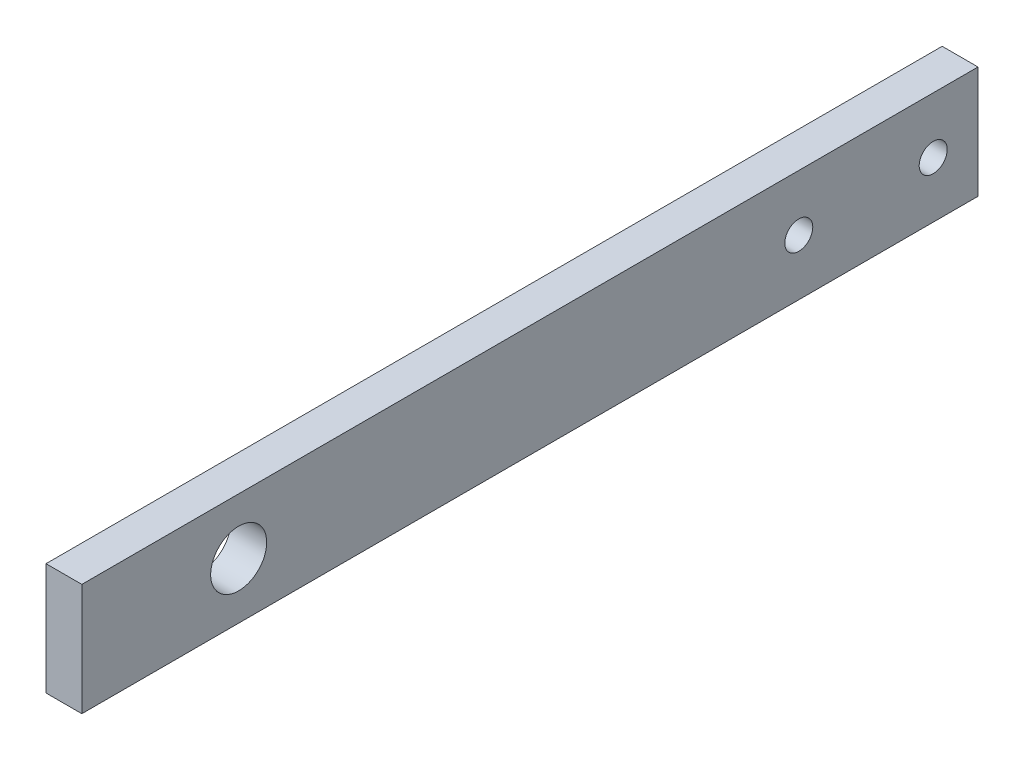
ISO-10303-21;
HEADER;
FILE_DESCRIPTION(('STEP AP214'),'2;1');
FILE_NAME('part.step','',(''),(''),'','','');
FILE_SCHEMA(('AUTOMOTIVE_DESIGN { 1 0 10303 214 1 1 1 1 }'));
ENDSEC;
DATA;
#1=APPLICATION_CONTEXT('core data for automotive mechanical design processes');
#2=APPLICATION_PROTOCOL_DEFINITION('international standard','automotive_design',2000,#1);
#3=PRODUCT_CONTEXT('',#1,'mechanical');
#4=PRODUCT('Part','Part','',(#3));
#5=PRODUCT_RELATED_PRODUCT_CATEGORY('part','',(#4));
#6=PRODUCT_DEFINITION_FORMATION('','',#4);
#7=PRODUCT_DEFINITION_CONTEXT('part definition',#1,'design');
#8=PRODUCT_DEFINITION('design','',#6,#7);
#9=PRODUCT_DEFINITION_SHAPE('','',#8);
#10=(LENGTH_UNIT() NAMED_UNIT(*) SI_UNIT(.MILLI.,.METRE.));
#11=(NAMED_UNIT(*) PLANE_ANGLE_UNIT() SI_UNIT($,.RADIAN.));
#12=(NAMED_UNIT(*) SI_UNIT($,.STERADIAN.) SOLID_ANGLE_UNIT());
#13=UNCERTAINTY_MEASURE_WITH_UNIT(LENGTH_MEASURE(1.E-05),#10,'distance_accuracy_value','');
#14=(GEOMETRIC_REPRESENTATION_CONTEXT(3) GLOBAL_UNCERTAINTY_ASSIGNED_CONTEXT((#13)) GLOBAL_UNIT_ASSIGNED_CONTEXT((#10,
#11,#12)) REPRESENTATION_CONTEXT('',''));
#15=CARTESIAN_POINT('',(0.,0.,0.));
#16=DIRECTION('',(0.,0.,1.));
#17=DIRECTION('',(1.,0.,0.));
#18=AXIS2_PLACEMENT_3D('',#15,#16,#17);
#19=CARTESIAN_POINT('',(2.032,0.,0.));
#20=DIRECTION('',(0.,0.,-1.));
#21=DIRECTION('',(-1.,0.,0.));
#22=AXIS2_PLACEMENT_3D('',#19,#20,#21);
#23=PLANE('',#22);
#24=DIRECTION('',(0.,-1.,0.));
#25=VECTOR('',#24,1.);
#26=CARTESIAN_POINT('',(0.,0.,0.));
#27=LINE('',#26,#25);
#28=CARTESIAN_POINT('',(0.,6.35,0.));
#29=VERTEX_POINT('',#28);
#30=CARTESIAN_POINT('',(0.,0.,0.));
#31=VERTEX_POINT('',#30);
#32=EDGE_CURVE('E98',#29,#31,#27,.T.);
#33=ORIENTED_EDGE('',*,*,#32,.T.);
#34=DIRECTION('',(-1.,0.,0.));
#35=VECTOR('',#34,1.);
#36=CARTESIAN_POINT('',(2.032,0.,0.));
#37=LINE('',#36,#35);
#38=CARTESIAN_POINT('',(2.032,0.,0.));
#39=VERTEX_POINT('',#38);
#40=EDGE_CURVE('E11',#39,#31,#37,.T.);
#41=ORIENTED_EDGE('',*,*,#40,.F.);
#42=DIRECTION('',(0.,-1.,0.));
#43=VECTOR('',#42,1.);
#44=CARTESIAN_POINT('',(2.032,0.,0.));
#45=LINE('',#44,#43);
#46=CARTESIAN_POINT('',(2.032,6.35,0.));
#47=VERTEX_POINT('',#46);
#48=EDGE_CURVE('E85',#47,#39,#45,.T.);
#49=ORIENTED_EDGE('',*,*,#48,.F.);
#50=DIRECTION('',(-1.,0.,0.));
#51=VECTOR('',#50,1.);
#52=CARTESIAN_POINT('',(2.032,6.35,0.));
#53=LINE('',#52,#51);
#54=EDGE_CURVE('E94',#47,#29,#53,.T.);
#55=ORIENTED_EDGE('',*,*,#54,.T.);
#56=EDGE_LOOP('',(#33,#41,#49,#55));
#57=FACE_BOUND('',#56,.T.);
#58=ADVANCED_FACE('F33',(#57),#23,.F.);
#59=CARTESIAN_POINT('',(2.032,0.,0.));
#60=DIRECTION('',(0.,1.,0.));
#61=DIRECTION('',(0.,0.,1.));
#62=AXIS2_PLACEMENT_3D('',#59,#60,#61);
#63=PLANE('',#62);
#64=DIRECTION('',(0.,0.,-1.));
#65=VECTOR('',#64,1.);
#66=CARTESIAN_POINT('',(0.,0.,0.));
#67=LINE('',#66,#65);
#68=CARTESIAN_POINT('',(0.,0.,-50.8));
#69=VERTEX_POINT('',#68);
#70=EDGE_CURVE('E89',#31,#69,#67,.T.);
#71=ORIENTED_EDGE('',*,*,#70,.T.);
#72=DIRECTION('',(-1.,0.,0.));
#73=VECTOR('',#72,1.);
#74=CARTESIAN_POINT('',(2.032,0.,-50.8));
#75=LINE('',#74,#73);
#76=CARTESIAN_POINT('',(2.032,0.,-50.8));
#77=VERTEX_POINT('',#76);
#78=EDGE_CURVE('E42',#77,#69,#75,.T.);
#79=ORIENTED_EDGE('',*,*,#78,.F.);
#80=DIRECTION('',(0.,0.,-1.));
#81=VECTOR('',#80,1.);
#82=CARTESIAN_POINT('',(2.032,0.,0.));
#83=LINE('',#82,#81);
#84=EDGE_CURVE('E80',#39,#77,#83,.T.);
#85=ORIENTED_EDGE('',*,*,#84,.F.);
#86=ORIENTED_EDGE('',*,*,#40,.T.);
#87=EDGE_LOOP('',(#71,#79,#85,#86));
#88=FACE_BOUND('',#87,.T.);
#89=ADVANCED_FACE('F88',(#88),#63,.F.);
#90=CARTESIAN_POINT('',(2.032,0.,-50.8));
#91=DIRECTION('',(0.,0.,1.));
#92=DIRECTION('',(1.,0.,0.));
#93=AXIS2_PLACEMENT_3D('',#90,#91,#92);
#94=PLANE('',#93);
#95=DIRECTION('',(0.,1.,0.));
#96=VECTOR('',#95,1.);
#97=CARTESIAN_POINT('',(0.,0.,-50.8));
#98=LINE('',#97,#96);
#99=CARTESIAN_POINT('',(0.,6.35,-50.8));
#100=VERTEX_POINT('',#99);
#101=EDGE_CURVE('E67',#69,#100,#98,.T.);
#102=ORIENTED_EDGE('',*,*,#101,.T.);
#103=DIRECTION('',(-1.,0.,0.));
#104=VECTOR('',#103,1.);
#105=CARTESIAN_POINT('',(2.032,6.35,-50.8));
#106=LINE('',#105,#104);
#107=CARTESIAN_POINT('',(2.032,6.35,-50.8));
#108=VERTEX_POINT('',#107);
#109=EDGE_CURVE('E90',#108,#100,#106,.T.);
#110=ORIENTED_EDGE('',*,*,#109,.F.);
#111=DIRECTION('',(0.,1.,0.));
#112=VECTOR('',#111,1.);
#113=CARTESIAN_POINT('',(2.032,0.,-50.8));
#114=LINE('',#113,#112);
#115=EDGE_CURVE('E83',#77,#108,#114,.T.);
#116=ORIENTED_EDGE('',*,*,#115,.F.);
#117=ORIENTED_EDGE('',*,*,#78,.T.);
#118=EDGE_LOOP('',(#102,#110,#116,#117));
#119=FACE_BOUND('',#118,.T.);
#120=ADVANCED_FACE('F92',(#119),#94,.F.);
#121=CARTESIAN_POINT('',(2.032,6.35,0.));
#122=DIRECTION('',(0.,-1.,0.));
#123=DIRECTION('',(0.,0.,-1.));
#124=AXIS2_PLACEMENT_3D('',#121,#122,#123);
#125=PLANE('',#124);
#126=DIRECTION('',(0.,0.,1.));
#127=VECTOR('',#126,1.);
#128=CARTESIAN_POINT('',(0.,6.35,0.));
#129=LINE('',#128,#127);
#130=EDGE_CURVE('E73',#100,#29,#129,.T.);
#131=ORIENTED_EDGE('',*,*,#130,.T.);
#132=ORIENTED_EDGE('',*,*,#54,.F.);
#133=DIRECTION('',(0.,0.,1.));
#134=VECTOR('',#133,1.);
#135=CARTESIAN_POINT('',(2.032,6.35,0.));
#136=LINE('',#135,#134);
#137=EDGE_CURVE('E50',#108,#47,#136,.T.);
#138=ORIENTED_EDGE('',*,*,#137,.F.);
#139=ORIENTED_EDGE('',*,*,#109,.T.);
#140=EDGE_LOOP('',(#131,#132,#138,#139));
#141=FACE_BOUND('',#140,.T.);
#142=ADVANCED_FACE('F106',(#141),#125,.F.);
#143=CARTESIAN_POINT('',(2.032,0.,0.));
#144=DIRECTION('',(-1.,0.,0.));
#145=DIRECTION('',(0.,0.,1.));
#146=AXIS2_PLACEMENT_3D('',#143,#144,#145);
#147=PLANE('',#146);
#148=CARTESIAN_POINT('',(2.032,3.175,-8.89));
#149=DIRECTION('',(1.,0.,0.));
#150=DIRECTION('',(0.,0.,-1.));
#151=AXIS2_PLACEMENT_3D('',#148,#149,#150);
#152=CIRCLE('',#151,1.58749999999999);
#153=CARTESIAN_POINT('',(2.032,3.175,-10.4775));
#154=VERTEX_POINT('',#153);
#155=EDGE_CURVE('E123',#154,#154,#152,.T.);
#156=ORIENTED_EDGE('',*,*,#155,.F.);
#157=EDGE_LOOP('',(#156));
#158=FACE_BOUND('',#157,.T.);
#159=CARTESIAN_POINT('',(2.032,3.175,-40.64));
#160=DIRECTION('',(1.,0.,0.));
#161=DIRECTION('',(0.,0.,-1.));
#162=AXIS2_PLACEMENT_3D('',#159,#160,#161);
#163=CIRCLE('',#162,0.793749999999989);
#164=CARTESIAN_POINT('',(2.032,3.175,-41.43375));
#165=VERTEX_POINT('',#164);
#166=EDGE_CURVE('E117',#165,#165,#163,.T.);
#167=ORIENTED_EDGE('',*,*,#166,.F.);
#168=EDGE_LOOP('',(#167));
#169=FACE_BOUND('',#168,.T.);
#170=CARTESIAN_POINT('',(2.032,3.175,-48.26));
#171=DIRECTION('',(1.,0.,0.));
#172=DIRECTION('',(0.,0.,-1.));
#173=AXIS2_PLACEMENT_3D('',#170,#171,#172);
#174=CIRCLE('',#173,0.793749999999989);
#175=CARTESIAN_POINT('',(2.032,3.175,-49.05375));
#176=VERTEX_POINT('',#175);
#177=EDGE_CURVE('E114',#176,#176,#174,.T.);
#178=ORIENTED_EDGE('',*,*,#177,.F.);
#179=EDGE_LOOP('',(#178));
#180=FACE_BOUND('',#179,.T.);
#181=ORIENTED_EDGE('',*,*,#48,.T.);
#182=ORIENTED_EDGE('',*,*,#84,.T.);
#183=ORIENTED_EDGE('',*,*,#115,.T.);
#184=ORIENTED_EDGE('',*,*,#137,.T.);
#185=EDGE_LOOP('',(#181,#182,#183,#184));
#186=FACE_BOUND('',#185,.T.);
#187=ADVANCED_FACE('F81',(#158,#169,#180,#186),#147,.F.);
#188=CARTESIAN_POINT('',(0.,0.,0.));
#189=DIRECTION('',(-1.,0.,0.));
#190=DIRECTION('',(0.,0.,1.));
#191=AXIS2_PLACEMENT_3D('',#188,#189,#190);
#192=PLANE('',#191);
#193=CARTESIAN_POINT('',(0.,3.175,-8.89));
#194=DIRECTION('',(-1.,0.,0.));
#195=DIRECTION('',(0.,0.,1.));
#196=AXIS2_PLACEMENT_3D('',#193,#194,#195);
#197=CIRCLE('',#196,1.58749999999999);
#198=CARTESIAN_POINT('',(0.,3.175,-7.30250000000001));
#199=VERTEX_POINT('',#198);
#200=EDGE_CURVE('E120',#199,#199,#197,.T.);
#201=ORIENTED_EDGE('',*,*,#200,.F.);
#202=EDGE_LOOP('',(#201));
#203=FACE_BOUND('',#202,.T.);
#204=CARTESIAN_POINT('',(0.,3.175,-40.64));
#205=DIRECTION('',(-1.,0.,0.));
#206=DIRECTION('',(0.,0.,1.));
#207=AXIS2_PLACEMENT_3D('',#204,#205,#206);
#208=CIRCLE('',#207,0.793749999999984);
#209=CARTESIAN_POINT('',(0.,3.175,-39.84625));
#210=VERTEX_POINT('',#209);
#211=EDGE_CURVE('E36',#210,#210,#208,.T.);
#212=ORIENTED_EDGE('',*,*,#211,.F.);
#213=EDGE_LOOP('',(#212));
#214=FACE_BOUND('',#213,.T.);
#215=CARTESIAN_POINT('',(0.,3.175,-48.26));
#216=DIRECTION('',(-1.,0.,0.));
#217=DIRECTION('',(0.,0.,1.));
#218=AXIS2_PLACEMENT_3D('',#215,#216,#217);
#219=CIRCLE('',#218,0.793749999999985);
#220=CARTESIAN_POINT('',(0.,3.175,-47.46625));
#221=VERTEX_POINT('',#220);
#222=EDGE_CURVE('E101',#221,#221,#219,.T.);
#223=ORIENTED_EDGE('',*,*,#222,.F.);
#224=EDGE_LOOP('',(#223));
#225=FACE_BOUND('',#224,.T.);
#226=ORIENTED_EDGE('',*,*,#32,.F.);
#227=ORIENTED_EDGE('',*,*,#130,.F.);
#228=ORIENTED_EDGE('',*,*,#101,.F.);
#229=ORIENTED_EDGE('',*,*,#70,.F.);
#230=EDGE_LOOP('',(#226,#227,#228,#229));
#231=FACE_BOUND('',#230,.T.);
#232=ADVANCED_FACE('F109',(#203,#214,#225,#231),#192,.T.);
#233=CARTESIAN_POINT('',(2.032,3.175,-48.26));
#234=DIRECTION('',(1.,0.,0.));
#235=DIRECTION('',(0.,0.,-1.));
#236=AXIS2_PLACEMENT_3D('',#233,#234,#235);
#237=CYLINDRICAL_SURFACE('',#236,0.793749999999985);
#238=ORIENTED_EDGE('',*,*,#222,.T.);
#239=EDGE_LOOP('',(#238));
#240=FACE_BOUND('',#239,.T.);
#241=ORIENTED_EDGE('',*,*,#177,.T.);
#242=EDGE_LOOP('',(#241));
#243=FACE_BOUND('',#242,.T.);
#244=ADVANCED_FACE('F136',(#240,#243),#237,.F.);
#245=CARTESIAN_POINT('',(2.032,3.175,-40.64));
#246=DIRECTION('',(1.,0.,0.));
#247=DIRECTION('',(0.,0.,-1.));
#248=AXIS2_PLACEMENT_3D('',#245,#246,#247);
#249=CYLINDRICAL_SURFACE('',#248,0.793749999999984);
#250=ORIENTED_EDGE('',*,*,#211,.T.);
#251=EDGE_LOOP('',(#250));
#252=FACE_BOUND('',#251,.T.);
#253=ORIENTED_EDGE('',*,*,#166,.T.);
#254=EDGE_LOOP('',(#253));
#255=FACE_BOUND('',#254,.T.);
#256=ADVANCED_FACE('F138',(#252,#255),#249,.F.);
#257=CARTESIAN_POINT('',(2.032,3.175,-8.89));
#258=DIRECTION('',(1.,0.,0.));
#259=DIRECTION('',(0.,0.,-1.));
#260=AXIS2_PLACEMENT_3D('',#257,#258,#259);
#261=CYLINDRICAL_SURFACE('',#260,1.58749999999999);
#262=ORIENTED_EDGE('',*,*,#200,.T.);
#263=EDGE_LOOP('',(#262));
#264=FACE_BOUND('',#263,.T.);
#265=ORIENTED_EDGE('',*,*,#155,.T.);
#266=EDGE_LOOP('',(#265));
#267=FACE_BOUND('',#266,.T.);
#268=ADVANCED_FACE('F127',(#264,#267),#261,.F.);
#269=CLOSED_SHELL('',(#58,#89,#120,#142,#187,#232,#244,#256,#268));
#270=MANIFOLD_SOLID_BREP('B2',#269);
#271=ADVANCED_BREP_SHAPE_REPRESENTATION('',(#18,#270),#14);
#272=SHAPE_DEFINITION_REPRESENTATION(#9,#271);
ENDSEC;
END-ISO-10303-21;
